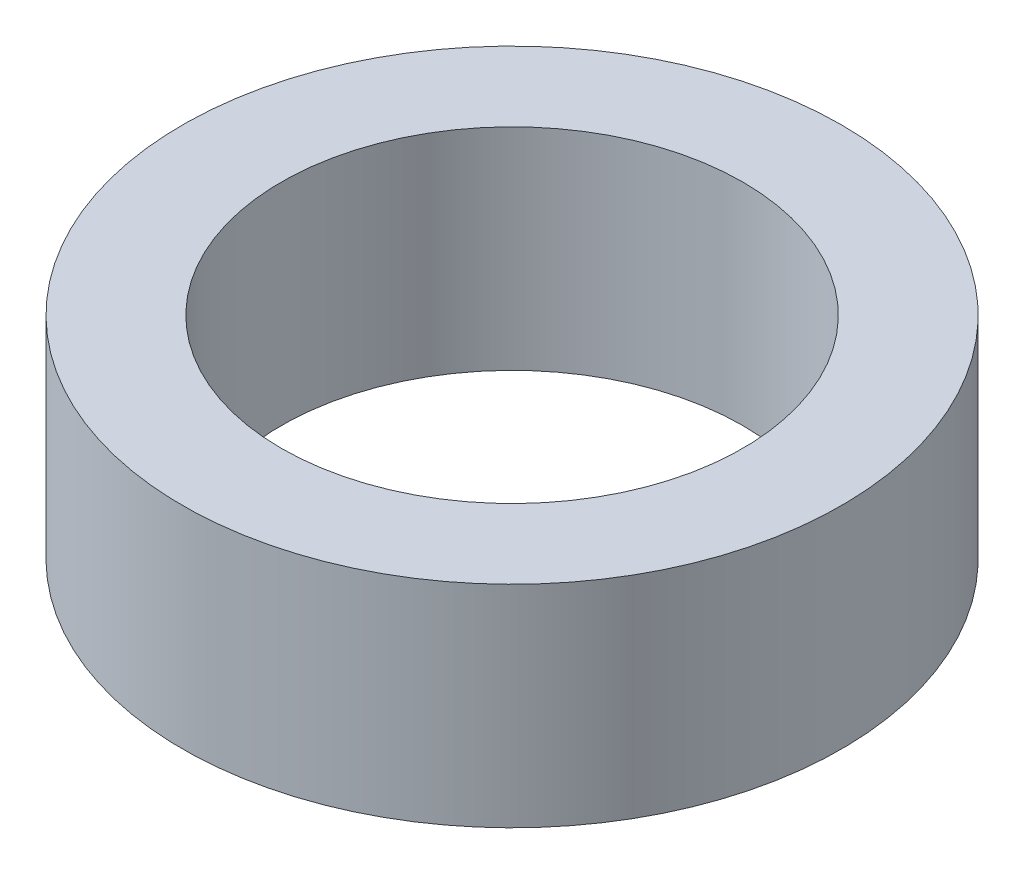
ISO-10303-21;
HEADER;
FILE_DESCRIPTION(('STEP AP214'),'2;1');
FILE_NAME('part.step','',(''),(''),'','','');
FILE_SCHEMA(('AUTOMOTIVE_DESIGN { 1 0 10303 214 1 1 1 1 }'));
ENDSEC;
DATA;
#1=APPLICATION_CONTEXT('core data for automotive mechanical design processes');
#2=APPLICATION_PROTOCOL_DEFINITION('international standard','automotive_design',2000,#1);
#3=PRODUCT_CONTEXT('',#1,'mechanical');
#4=PRODUCT('Part','Part','',(#3));
#5=PRODUCT_RELATED_PRODUCT_CATEGORY('part','',(#4));
#6=PRODUCT_DEFINITION_FORMATION('','',#4);
#7=PRODUCT_DEFINITION_CONTEXT('part definition',#1,'design');
#8=PRODUCT_DEFINITION('design','',#6,#7);
#9=PRODUCT_DEFINITION_SHAPE('','',#8);
#10=(LENGTH_UNIT() NAMED_UNIT(*) SI_UNIT(.MILLI.,.METRE.));
#11=(NAMED_UNIT(*) PLANE_ANGLE_UNIT() SI_UNIT($,.RADIAN.));
#12=(NAMED_UNIT(*) SI_UNIT($,.STERADIAN.) SOLID_ANGLE_UNIT());
#13=UNCERTAINTY_MEASURE_WITH_UNIT(LENGTH_MEASURE(1.E-05),#10,'distance_accuracy_value','');
#14=(GEOMETRIC_REPRESENTATION_CONTEXT(3) GLOBAL_UNCERTAINTY_ASSIGNED_CONTEXT((#13)) GLOBAL_UNIT_ASSIGNED_CONTEXT((#10,
#11,#12)) REPRESENTATION_CONTEXT('',''));
#15=CARTESIAN_POINT('',(0.,0.,0.));
#16=DIRECTION('',(0.,0.,1.));
#17=DIRECTION('',(1.,0.,0.));
#18=AXIS2_PLACEMENT_3D('',#15,#16,#17);
#19=CARTESIAN_POINT('',(0.,0.,0.));
#20=DIRECTION('',(0.,-1.,0.));
#21=DIRECTION('',(0.,0.,-1.));
#22=AXIS2_PLACEMENT_3D('',#19,#20,#21);
#23=CYLINDRICAL_SURFACE('',#22,22.225);
#24=CARTESIAN_POINT('',(0.,0.,0.));
#25=DIRECTION('',(0.,-1.,0.));
#26=DIRECTION('',(0.,0.,-1.));
#27=AXIS2_PLACEMENT_3D('',#24,#25,#26);
#28=CIRCLE('',#27,22.225);
#29=CARTESIAN_POINT('',(0.,0.,-22.225));
#30=VERTEX_POINT('',#29);
#31=EDGE_CURVE('E46',#30,#30,#28,.T.);
#32=ORIENTED_EDGE('',*,*,#31,.T.);
#33=EDGE_LOOP('',(#32));
#34=FACE_BOUND('',#33,.T.);
#35=CARTESIAN_POINT('',(0.,20.32,0.));
#36=DIRECTION('',(0.,-1.,0.));
#37=DIRECTION('',(0.,0.,-1.));
#38=AXIS2_PLACEMENT_3D('',#35,#36,#37);
#39=CIRCLE('',#38,22.225);
#40=CARTESIAN_POINT('',(0.,20.32,-22.225));
#41=VERTEX_POINT('',#40);
#42=EDGE_CURVE('E10',#41,#41,#39,.T.);
#43=ORIENTED_EDGE('',*,*,#42,.F.);
#44=EDGE_LOOP('',(#43));
#45=FACE_BOUND('',#44,.T.);
#46=ADVANCED_FACE('F32',(#34,#45),#23,.F.);
#47=CARTESIAN_POINT('',(22.225,20.32,0.));
#48=DIRECTION('',(0.,1.,0.));
#49=DIRECTION('',(0.,0.,1.));
#50=AXIS2_PLACEMENT_3D('',#47,#48,#49);
#51=PLANE('',#50);
#52=ORIENTED_EDGE('',*,*,#42,.T.);
#53=EDGE_LOOP('',(#52));
#54=FACE_BOUND('',#53,.T.);
#55=CARTESIAN_POINT('',(0.,20.32,0.));
#56=DIRECTION('',(0.,-1.,0.));
#57=DIRECTION('',(0.,0.,-1.));
#58=AXIS2_PLACEMENT_3D('',#55,#56,#57);
#59=CIRCLE('',#58,31.75);
#60=CARTESIAN_POINT('',(0.,20.32,-31.75));
#61=VERTEX_POINT('',#60);
#62=EDGE_CURVE('E38',#61,#61,#59,.T.);
#63=ORIENTED_EDGE('',*,*,#62,.F.);
#64=EDGE_LOOP('',(#63));
#65=FACE_BOUND('',#64,.T.);
#66=ADVANCED_FACE('F62',(#54,#65),#51,.T.);
#67=CARTESIAN_POINT('',(0.,0.,0.));
#68=DIRECTION('',(0.,-1.,0.));
#69=DIRECTION('',(0.,0.,-1.));
#70=AXIS2_PLACEMENT_3D('',#67,#68,#69);
#71=CYLINDRICAL_SURFACE('',#70,31.75);
#72=ORIENTED_EDGE('',*,*,#62,.T.);
#73=EDGE_LOOP('',(#72));
#74=FACE_BOUND('',#73,.T.);
#75=CARTESIAN_POINT('',(0.,0.,0.));
#76=DIRECTION('',(0.,-1.,0.));
#77=DIRECTION('',(0.,0.,-1.));
#78=AXIS2_PLACEMENT_3D('',#75,#76,#77);
#79=CIRCLE('',#78,31.75);
#80=CARTESIAN_POINT('',(0.,0.,-31.75));
#81=VERTEX_POINT('',#80);
#82=EDGE_CURVE('E42',#81,#81,#79,.T.);
#83=ORIENTED_EDGE('',*,*,#82,.F.);
#84=EDGE_LOOP('',(#83));
#85=FACE_BOUND('',#84,.T.);
#86=ADVANCED_FACE('F56',(#74,#85),#71,.T.);
#87=CARTESIAN_POINT('',(22.225,0.,0.));
#88=DIRECTION('',(0.,-1.,0.));
#89=DIRECTION('',(0.,0.,-1.));
#90=AXIS2_PLACEMENT_3D('',#87,#88,#89);
#91=PLANE('',#90);
#92=ORIENTED_EDGE('',*,*,#82,.T.);
#93=EDGE_LOOP('',(#92));
#94=FACE_BOUND('',#93,.T.);
#95=ORIENTED_EDGE('',*,*,#31,.F.);
#96=EDGE_LOOP('',(#95));
#97=FACE_BOUND('',#96,.T.);
#98=ADVANCED_FACE('F54',(#94,#97),#91,.T.);
#99=CLOSED_SHELL('',(#46,#66,#86,#98));
#100=MANIFOLD_SOLID_BREP('B2',#99);
#101=ADVANCED_BREP_SHAPE_REPRESENTATION('',(#18,#100),#14);
#102=SHAPE_DEFINITION_REPRESENTATION(#9,#101);
ENDSEC;
END-ISO-10303-21;
